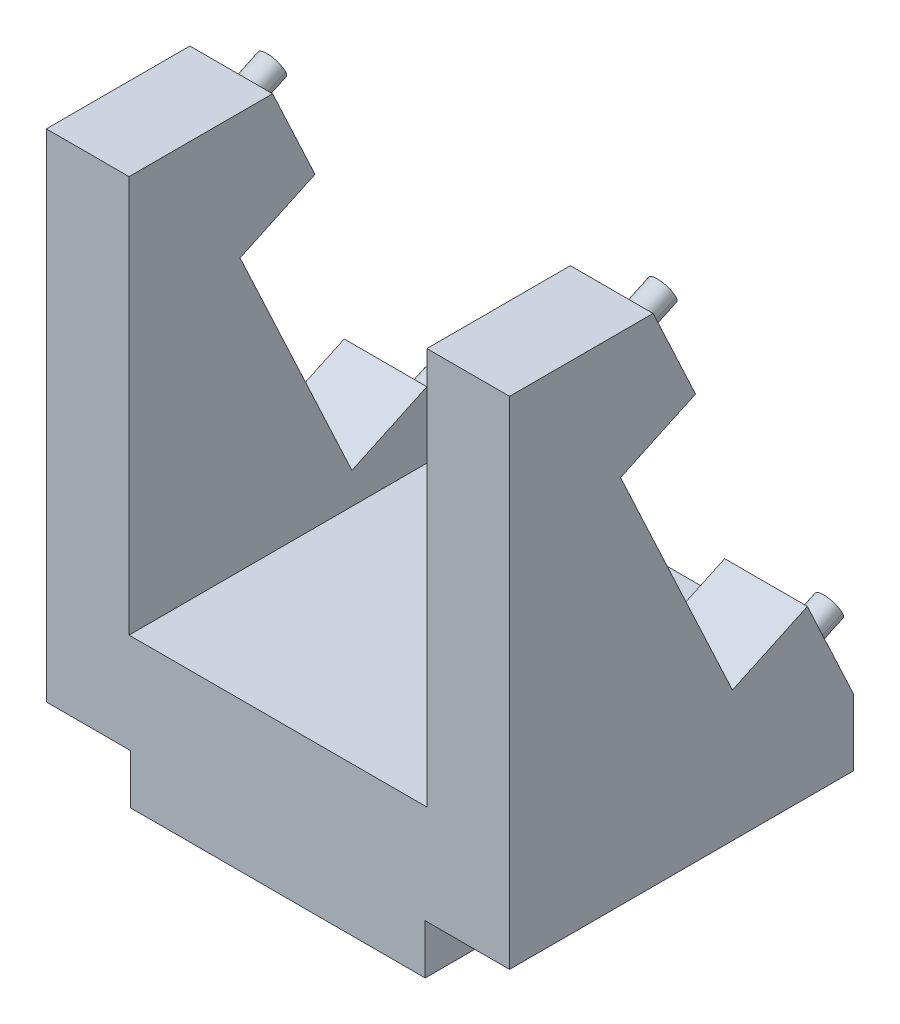
ISO-10303-21;
HEADER;
FILE_DESCRIPTION(('STEP AP214'),'2;1');
FILE_NAME('part.step','',(''),(''),'','','');
FILE_SCHEMA(('AUTOMOTIVE_DESIGN { 1 0 10303 214 1 1 1 1 }'));
ENDSEC;
DATA;
#1=APPLICATION_CONTEXT('core data for automotive mechanical design processes');
#2=APPLICATION_PROTOCOL_DEFINITION('international standard','automotive_design',2000,#1);
#3=PRODUCT_CONTEXT('',#1,'mechanical');
#4=PRODUCT('Part','Part','',(#3));
#5=PRODUCT_RELATED_PRODUCT_CATEGORY('part','',(#4));
#6=PRODUCT_DEFINITION_FORMATION('','',#4);
#7=PRODUCT_DEFINITION_CONTEXT('part definition',#1,'design');
#8=PRODUCT_DEFINITION('design','',#6,#7);
#9=PRODUCT_DEFINITION_SHAPE('','',#8);
#10=(LENGTH_UNIT() NAMED_UNIT(*) SI_UNIT(.MILLI.,.METRE.));
#11=(NAMED_UNIT(*) PLANE_ANGLE_UNIT() SI_UNIT($,.RADIAN.));
#12=(NAMED_UNIT(*) SI_UNIT($,.STERADIAN.) SOLID_ANGLE_UNIT());
#13=UNCERTAINTY_MEASURE_WITH_UNIT(LENGTH_MEASURE(1.E-05),#10,'distance_accuracy_value','');
#14=(GEOMETRIC_REPRESENTATION_CONTEXT(3) GLOBAL_UNCERTAINTY_ASSIGNED_CONTEXT((#13)) GLOBAL_UNIT_ASSIGNED_CONTEXT((#10,
#11,#12)) REPRESENTATION_CONTEXT('',''));
#15=CARTESIAN_POINT('',(0.,0.,0.));
#16=DIRECTION('',(0.,0.,1.));
#17=DIRECTION('',(1.,0.,0.));
#18=AXIS2_PLACEMENT_3D('',#15,#16,#17);
#19=CARTESIAN_POINT('',(-9.,6.,20.8));
#20=DIRECTION('',(0.,-1.,0.));
#21=DIRECTION('',(0.,0.,-1.));
#22=AXIS2_PLACEMENT_3D('',#19,#20,#21);
#23=PLANE('',#22);
#24=DIRECTION('',(0.,0.,-1.));
#25=VECTOR('',#24,1.);
#26=CARTESIAN_POINT('',(9.,6.,20.8));
#27=LINE('',#26,#25);
#28=CARTESIAN_POINT('',(9.,6.,20.8));
#29=VERTEX_POINT('',#28);
#30=CARTESIAN_POINT('',(9.,6.,0.93261531631));
#31=VERTEX_POINT('',#30);
#32=EDGE_CURVE('E292',#29,#31,#27,.T.);
#33=ORIENTED_EDGE('',*,*,#32,.T.);
#34=DIRECTION('',(1.,0.,0.));
#35=VECTOR('',#34,1.);
#36=CARTESIAN_POINT('',(-9.,6.,0.93261531631));
#37=LINE('',#36,#35);
#38=CARTESIAN_POINT('',(-9.,6.,0.93261531631));
#39=VERTEX_POINT('',#38);
#40=EDGE_CURVE('E399',#39,#31,#37,.T.);
#41=ORIENTED_EDGE('',*,*,#40,.F.);
#42=DIRECTION('',(0.,0.,-1.));
#43=VECTOR('',#42,1.);
#44=CARTESIAN_POINT('',(-9.,6.,20.8));
#45=LINE('',#44,#43);
#46=CARTESIAN_POINT('',(-9.,6.,20.8));
#47=VERTEX_POINT('',#46);
#48=EDGE_CURVE('E307',#47,#39,#45,.T.);
#49=ORIENTED_EDGE('',*,*,#48,.F.);
#50=DIRECTION('',(1.,0.,0.));
#51=VECTOR('',#50,1.);
#52=CARTESIAN_POINT('',(-9.,6.,20.8));
#53=LINE('',#52,#51);
#54=EDGE_CURVE('E335',#47,#29,#53,.T.);
#55=ORIENTED_EDGE('',*,*,#54,.T.);
#56=EDGE_LOOP('',(#33,#41,#49,#55));
#57=FACE_BOUND('',#56,.T.);
#58=ADVANCED_FACE('F16',(#57),#23,.F.);
#59=CARTESIAN_POINT('',(-8.9,0.,16.8));
#60=DIRECTION('',(0.,0.,-1.));
#61=DIRECTION('',(0.,-1.,0.));
#62=AXIS2_PLACEMENT_3D('',#59,#60,#61);
#63=PLANE('',#62);
#64=DIRECTION('',(0.,-1.,0.));
#65=VECTOR('',#64,1.);
#66=CARTESIAN_POINT('',(8.9,0.,16.8));
#67=LINE('',#66,#65);
#68=CARTESIAN_POINT('',(8.9,0.,16.8));
#69=VERTEX_POINT('',#68);
#70=CARTESIAN_POINT('',(8.9,-3.,16.8));
#71=VERTEX_POINT('',#70);
#72=EDGE_CURVE('E10',#69,#71,#67,.T.);
#73=ORIENTED_EDGE('',*,*,#72,.T.);
#74=DIRECTION('',(1.,0.,0.));
#75=VECTOR('',#74,1.);
#76=CARTESIAN_POINT('',(-8.9,-3.,16.8));
#77=LINE('',#76,#75);
#78=CARTESIAN_POINT('',(-8.9,-3.,16.8));
#79=VERTEX_POINT('',#78);
#80=EDGE_CURVE('E44',#79,#71,#77,.T.);
#81=ORIENTED_EDGE('',*,*,#80,.F.);
#82=DIRECTION('',(0.,-1.,0.));
#83=VECTOR('',#82,1.);
#84=CARTESIAN_POINT('',(-8.9,0.,16.8));
#85=LINE('',#84,#83);
#86=CARTESIAN_POINT('',(-8.9,0.,16.8));
#87=VERTEX_POINT('',#86);
#88=EDGE_CURVE('E193',#87,#79,#85,.T.);
#89=ORIENTED_EDGE('',*,*,#88,.F.);
#90=DIRECTION('',(1.,0.,0.));
#91=VECTOR('',#90,1.);
#92=CARTESIAN_POINT('',(-8.9,0.,16.8));
#93=LINE('',#92,#91);
#94=EDGE_CURVE('E190',#87,#69,#93,.T.);
#95=ORIENTED_EDGE('',*,*,#94,.T.);
#96=EDGE_LOOP('',(#73,#81,#89,#95));
#97=FACE_BOUND('',#96,.T.);
#98=ADVANCED_FACE('F191',(#97),#63,.T.);
#99=CARTESIAN_POINT('',(8.9,0.,16.8));
#100=DIRECTION('',(1.,0.,0.));
#101=DIRECTION('',(0.,1.,0.));
#102=AXIS2_PLACEMENT_3D('',#99,#100,#101);
#103=PLANE('',#102);
#104=DIRECTION('',(0.,-1.,0.));
#105=VECTOR('',#104,1.);
#106=CARTESIAN_POINT('',(8.9,0.,20.8));
#107=LINE('',#106,#105);
#108=CARTESIAN_POINT('',(8.9,0.,20.8));
#109=VERTEX_POINT('',#108);
#110=CARTESIAN_POINT('',(8.9,-3.,20.8));
#111=VERTEX_POINT('',#110);
#112=EDGE_CURVE('E207',#109,#111,#107,.T.);
#113=ORIENTED_EDGE('',*,*,#112,.T.);
#114=DIRECTION('',(0.,0.,1.));
#115=VECTOR('',#114,1.);
#116=CARTESIAN_POINT('',(8.9,-3.,16.8));
#117=LINE('',#116,#115);
#118=EDGE_CURVE('E24',#71,#111,#117,.T.);
#119=ORIENTED_EDGE('',*,*,#118,.F.);
#120=ORIENTED_EDGE('',*,*,#72,.F.);
#121=DIRECTION('',(0.,0.,-1.));
#122=VECTOR('',#121,1.);
#123=CARTESIAN_POINT('',(8.9,0.,20.8));
#124=LINE('',#123,#122);
#125=EDGE_CURVE('E187',#109,#69,#124,.T.);
#126=ORIENTED_EDGE('',*,*,#125,.F.);
#127=EDGE_LOOP('',(#113,#119,#120,#126));
#128=FACE_BOUND('',#127,.T.);
#129=ADVANCED_FACE('F185',(#128),#103,.T.);
#130=CARTESIAN_POINT('',(0.,-3.,0.));
#131=DIRECTION('',(0.,-1.,0.));
#132=DIRECTION('',(0.,0.,-1.));
#133=AXIS2_PLACEMENT_3D('',#130,#131,#132);
#134=PLANE('',#133);
#135=DIRECTION('',(0.,0.,-1.));
#136=VECTOR('',#135,1.);
#137=CARTESIAN_POINT('',(-8.9,-3.,20.8));
#138=LINE('',#137,#136);
#139=CARTESIAN_POINT('',(-8.9,-3.,20.8));
#140=VERTEX_POINT('',#139);
#141=EDGE_CURVE('E213',#140,#79,#138,.T.);
#142=ORIENTED_EDGE('',*,*,#141,.T.);
#143=ORIENTED_EDGE('',*,*,#80,.T.);
#144=ORIENTED_EDGE('',*,*,#118,.T.);
#145=DIRECTION('',(-1.,0.,0.));
#146=VECTOR('',#145,1.);
#147=CARTESIAN_POINT('',(8.9,-3.,20.8));
#148=LINE('',#147,#146);
#149=EDGE_CURVE('E345',#111,#140,#148,.T.);
#150=ORIENTED_EDGE('',*,*,#149,.T.);
#151=EDGE_LOOP('',(#142,#143,#144,#150));
#152=FACE_BOUND('',#151,.T.);
#153=ADVANCED_FACE('F692',(#152),#134,.T.);
#154=CARTESIAN_POINT('',(-8.9,0.,20.8));
#155=DIRECTION('',(-1.,0.,0.));
#156=DIRECTION('',(0.,0.,1.));
#157=AXIS2_PLACEMENT_3D('',#154,#155,#156);
#158=PLANE('',#157);
#159=ORIENTED_EDGE('',*,*,#88,.T.);
#160=ORIENTED_EDGE('',*,*,#141,.F.);
#161=DIRECTION('',(0.,-1.,0.));
#162=VECTOR('',#161,1.);
#163=CARTESIAN_POINT('',(-8.9,0.,20.8));
#164=LINE('',#163,#162);
#165=CARTESIAN_POINT('',(-8.9,0.,20.8));
#166=VERTEX_POINT('',#165);
#167=EDGE_CURVE('E342',#166,#140,#164,.T.);
#168=ORIENTED_EDGE('',*,*,#167,.F.);
#169=DIRECTION('',(0.,0.,-1.));
#170=VECTOR('',#169,1.);
#171=CARTESIAN_POINT('',(-8.9,0.,20.8));
#172=LINE('',#171,#170);
#173=EDGE_CURVE('E197',#166,#87,#172,.T.);
#174=ORIENTED_EDGE('',*,*,#173,.T.);
#175=EDGE_LOOP('',(#159,#160,#168,#174));
#176=FACE_BOUND('',#175,.T.);
#177=ADVANCED_FACE('F697',(#176),#158,.T.);
#178=CARTESIAN_POINT('',(-14.,0.,0.));
#179=DIRECTION('',(0.,-1.,0.));
#180=DIRECTION('',(0.,0.,-1.));
#181=AXIS2_PLACEMENT_3D('',#178,#179,#180);
#182=PLANE('',#181);
#183=DIRECTION('',(1.,0.,0.));
#184=VECTOR('',#183,1.);
#185=CARTESIAN_POINT('',(-14.,0.,20.8));
#186=LINE('',#185,#184);
#187=CARTESIAN_POINT('',(-14.,0.,20.8));
#188=VERTEX_POINT('',#187);
#189=EDGE_CURVE('E338',#188,#166,#186,.T.);
#190=ORIENTED_EDGE('',*,*,#189,.F.);
#191=DIRECTION('',(0.,0.,1.));
#192=VECTOR('',#191,1.);
#193=CARTESIAN_POINT('',(-14.,0.,0.));
#194=LINE('',#193,#192);
#195=CARTESIAN_POINT('',(-14.,0.,0.));
#196=VERTEX_POINT('',#195);
#197=EDGE_CURVE('E297',#196,#188,#194,.T.);
#198=ORIENTED_EDGE('',*,*,#197,.F.);
#199=DIRECTION('',(1.,0.,0.));
#200=VECTOR('',#199,1.);
#201=CARTESIAN_POINT('',(-14.,0.,0.));
#202=LINE('',#201,#200);
#203=CARTESIAN_POINT('',(14.,0.,0.));
#204=VERTEX_POINT('',#203);
#205=EDGE_CURVE('E603',#196,#204,#202,.T.);
#206=ORIENTED_EDGE('',*,*,#205,.T.);
#207=DIRECTION('',(0.,0.,1.));
#208=VECTOR('',#207,1.);
#209=CARTESIAN_POINT('',(14.,0.,0.));
#210=LINE('',#209,#208);
#211=CARTESIAN_POINT('',(14.,0.,20.8));
#212=VERTEX_POINT('',#211);
#213=EDGE_CURVE('E253',#204,#212,#210,.T.);
#214=ORIENTED_EDGE('',*,*,#213,.T.);
#215=DIRECTION('',(1.,0.,0.));
#216=VECTOR('',#215,1.);
#217=CARTESIAN_POINT('',(8.9,0.,20.8));
#218=LINE('',#217,#216);
#219=EDGE_CURVE('E201',#109,#212,#218,.T.);
#220=ORIENTED_EDGE('',*,*,#219,.F.);
#221=ORIENTED_EDGE('',*,*,#125,.T.);
#222=ORIENTED_EDGE('',*,*,#94,.F.);
#223=ORIENTED_EDGE('',*,*,#173,.F.);
#224=EDGE_LOOP('',(#190,#198,#206,#214,#220,#221,#222,#223));
#225=FACE_BOUND('',#224,.T.);
#226=ADVANCED_FACE('F199',(#225),#182,.T.);
#227=CARTESIAN_POINT('',(0.,0.,20.8));
#228=DIRECTION('',(0.,0.,1.));
#229=DIRECTION('',(1.,0.,0.));
#230=AXIS2_PLACEMENT_3D('',#227,#228,#229);
#231=PLANE('',#230);
#232=DIRECTION('',(0.,1.,0.));
#233=VECTOR('',#232,1.);
#234=CARTESIAN_POINT('',(14.,0.,20.8));
#235=LINE('',#234,#233);
#236=CARTESIAN_POINT('',(14.,30.,20.8));
#237=VERTEX_POINT('',#236);
#238=EDGE_CURVE('E257',#212,#237,#235,.T.);
#239=ORIENTED_EDGE('',*,*,#238,.T.);
#240=DIRECTION('',(-1.,0.,0.));
#241=VECTOR('',#240,1.);
#242=CARTESIAN_POINT('',(14.,30.,20.8));
#243=LINE('',#242,#241);
#244=CARTESIAN_POINT('',(9.,30.,20.8));
#245=VERTEX_POINT('',#244);
#246=EDGE_CURVE('E328',#237,#245,#243,.T.);
#247=ORIENTED_EDGE('',*,*,#246,.T.);
#248=DIRECTION('',(0.,-1.,0.));
#249=VECTOR('',#248,1.);
#250=CARTESIAN_POINT('',(9.,30.,20.8));
#251=LINE('',#250,#249);
#252=EDGE_CURVE('E296',#245,#29,#251,.T.);
#253=ORIENTED_EDGE('',*,*,#252,.T.);
#254=ORIENTED_EDGE('',*,*,#54,.F.);
#255=DIRECTION('',(0.,-1.,0.));
#256=VECTOR('',#255,1.);
#257=CARTESIAN_POINT('',(-9.,30.,20.8));
#258=LINE('',#257,#256);
#259=CARTESIAN_POINT('',(-9.,30.,20.8));
#260=VERTEX_POINT('',#259);
#261=EDGE_CURVE('E312',#260,#47,#258,.T.);
#262=ORIENTED_EDGE('',*,*,#261,.F.);
#263=DIRECTION('',(-1.,0.,0.));
#264=VECTOR('',#263,1.);
#265=CARTESIAN_POINT('',(-9.,30.,20.8));
#266=LINE('',#265,#264);
#267=CARTESIAN_POINT('',(-14.,30.,20.8));
#268=VERTEX_POINT('',#267);
#269=EDGE_CURVE('E320',#260,#268,#266,.T.);
#270=ORIENTED_EDGE('',*,*,#269,.T.);
#271=DIRECTION('',(0.,-1.,0.));
#272=VECTOR('',#271,1.);
#273=CARTESIAN_POINT('',(-14.,30.,20.8));
#274=LINE('',#273,#272);
#275=EDGE_CURVE('E301',#268,#188,#274,.T.);
#276=ORIENTED_EDGE('',*,*,#275,.T.);
#277=ORIENTED_EDGE('',*,*,#189,.T.);
#278=ORIENTED_EDGE('',*,*,#167,.T.);
#279=ORIENTED_EDGE('',*,*,#149,.F.);
#280=ORIENTED_EDGE('',*,*,#112,.F.);
#281=ORIENTED_EDGE('',*,*,#219,.T.);
#282=EDGE_LOOP('',(#239,#247,#253,#254,#262,#270,#276,#277,#278,#279,#280,#281));
#283=FACE_BOUND('',#282,.T.);
#284=ADVANCED_FACE('F703',(#283),#231,.T.);
#285=CARTESIAN_POINT('',(-14.,30.,0.));
#286=DIRECTION('',(-1.,0.,0.));
#287=DIRECTION('',(0.,0.,1.));
#288=AXIS2_PLACEMENT_3D('',#285,#286,#287);
#289=PLANE('',#288);
#290=DIRECTION('',(0.,-0.906307787036659,-0.422618261740681));
#291=VECTOR('',#290,1.);
#292=CARTESIAN_POINT('',(-14.,22.38783328388,14.09127707196));
#293=LINE('',#292,#291);
#294=CARTESIAN_POINT('',(-14.,22.38783328388,14.09127707196));
#295=VERTEX_POINT('',#294);
#296=CARTESIAN_POINT('',(-14.,7.886908691297,7.329384884113));
#297=VERTEX_POINT('',#296);
#298=EDGE_CURVE('E272',#295,#297,#293,.T.);
#299=ORIENTED_EDGE('',*,*,#298,.T.);
#300=DIRECTION('',(0.,0.422618261740681,-0.906307787036659));
#301=VECTOR('',#300,1.);
#302=CARTESIAN_POINT('',(-14.,7.886908691297,7.329384884113));
#303=LINE('',#302,#301);
#304=CARTESIAN_POINT('',(-14.,10.,2.79784594893));
#305=VERTEX_POINT('',#304);
#306=EDGE_CURVE('E302',#297,#305,#303,.T.);
#307=ORIENTED_EDGE('',*,*,#306,.T.);
#308=DIRECTION('',(0.,-0.906307787036659,-0.422618261740681));
#309=VECTOR('',#308,1.);
#310=CARTESIAN_POINT('',(-14.,10.,2.79784594893));
#311=LINE('',#310,#309);
#312=CARTESIAN_POINT('',(-14.,4.,0.));
#313=VERTEX_POINT('',#312);
#314=EDGE_CURVE('E422',#305,#313,#311,.T.);
#315=ORIENTED_EDGE('',*,*,#314,.T.);
#316=DIRECTION('',(0.,-1.,0.));
#317=VECTOR('',#316,1.);
#318=CARTESIAN_POINT('',(-14.,4.,0.));
#319=LINE('',#318,#317);
#320=EDGE_CURVE('E484',#313,#196,#319,.T.);
#321=ORIENTED_EDGE('',*,*,#320,.T.);
#322=ORIENTED_EDGE('',*,*,#197,.T.);
#323=ORIENTED_EDGE('',*,*,#275,.F.);
#324=DIRECTION('',(0.,0.,1.));
#325=VECTOR('',#324,1.);
#326=CARTESIAN_POINT('',(-14.,30.,12.12399911203));
#327=LINE('',#326,#325);
#328=CARTESIAN_POINT('',(-14.,30.,12.12399911203));
#329=VERTEX_POINT('',#328);
#330=EDGE_CURVE('E316',#329,#268,#327,.T.);
#331=ORIENTED_EDGE('',*,*,#330,.F.);
#332=DIRECTION('',(0.,-0.906307787036659,-0.422618261740681));
#333=VECTOR('',#332,1.);
#334=CARTESIAN_POINT('',(-14.,30.,12.12399911203));
#335=LINE('',#334,#333);
#336=CARTESIAN_POINT('',(-14.,24.50092459259,9.559738136781));
#337=VERTEX_POINT('',#336);
#338=EDGE_CURVE('E483',#329,#337,#335,.T.);
#339=ORIENTED_EDGE('',*,*,#338,.T.);
#340=DIRECTION('',(0.,-0.422618261740681,0.906307787036659));
#341=VECTOR('',#340,1.);
#342=CARTESIAN_POINT('',(-14.,24.50092459259,9.559738136781));
#343=LINE('',#342,#341);
#344=EDGE_CURVE('E258',#337,#295,#343,.T.);
#345=ORIENTED_EDGE('',*,*,#344,.T.);
#346=EDGE_LOOP('',(#299,#307,#315,#321,#322,#323,#331,#339,#345));
#347=FACE_BOUND('',#346,.T.);
#348=ADVANCED_FACE('F706',(#347),#289,.T.);
#349=CARTESIAN_POINT('',(14.,7.886908691297,7.329384884113));
#350=DIRECTION('',(0.,-0.906307787036659,-0.422618261740681));
#351=DIRECTION('',(0.,0.422618261740681,-0.906307787036659));
#352=AXIS2_PLACEMENT_3D('',#349,#350,#351);
#353=PLANE('',#352);
#354=DIRECTION('',(-1.,0.,0.));
#355=VECTOR('',#354,1.);
#356=CARTESIAN_POINT('',(-9.,7.886908691297,7.329384884113));
#357=LINE('',#356,#355);
#358=CARTESIAN_POINT('',(-9.,7.886908691297,7.329384884113));
#359=VERTEX_POINT('',#358);
#360=EDGE_CURVE('E277',#359,#297,#357,.T.);
#361=ORIENTED_EDGE('',*,*,#360,.F.);
#362=DIRECTION('',(0.,0.422618261740681,-0.906307787036659));
#363=VECTOR('',#362,1.);
#364=CARTESIAN_POINT('',(-9.,7.886908691297,7.329384884113));
#365=LINE('',#364,#363);
#366=CARTESIAN_POINT('',(-9.,10.,2.79784594893));
#367=VERTEX_POINT('',#366);
#368=EDGE_CURVE('E311',#359,#367,#365,.T.);
#369=ORIENTED_EDGE('',*,*,#368,.T.);
#370=DIRECTION('',(-1.,0.,0.));
#371=VECTOR('',#370,1.);
#372=CARTESIAN_POINT('',(-9.,10.,2.79784594893));
#373=LINE('',#372,#371);
#374=EDGE_CURVE('E426',#367,#305,#373,.T.);
#375=ORIENTED_EDGE('',*,*,#374,.T.);
#376=ORIENTED_EDGE('',*,*,#306,.F.);
#377=EDGE_LOOP('',(#361,#369,#375,#376));
#378=FACE_BOUND('',#377,.T.);
#379=ADVANCED_FACE('F584',(#378),#353,.F.);
#380=CARTESIAN_POINT('',(14.,7.886908691297,7.329384884113));
#381=DIRECTION('',(0.,-0.906307787036659,-0.422618261740681));
#382=DIRECTION('',(0.,0.422618261740681,-0.906307787036659));
#383=AXIS2_PLACEMENT_3D('',#380,#381,#382);
#384=PLANE('',#383);
#385=DIRECTION('',(1.,0.,0.));
#386=VECTOR('',#385,1.);
#387=CARTESIAN_POINT('',(9.,10.,2.79784594893));
#388=LINE('',#387,#386);
#389=CARTESIAN_POINT('',(9.,10.,2.79784594893));
#390=VERTEX_POINT('',#389);
#391=CARTESIAN_POINT('',(14.,10.,2.79784594893));
#392=VERTEX_POINT('',#391);
#393=EDGE_CURVE('E414',#390,#392,#388,.T.);
#394=ORIENTED_EDGE('',*,*,#393,.F.);
#395=DIRECTION('',(0.,0.422618261740681,-0.906307787036659));
#396=VECTOR('',#395,1.);
#397=CARTESIAN_POINT('',(9.,7.886908691297,7.329384884113));
#398=LINE('',#397,#396);
#399=CARTESIAN_POINT('',(9.,7.886908691297,7.329384884113));
#400=VERTEX_POINT('',#399);
#401=EDGE_CURVE('E276',#400,#390,#398,.T.);
#402=ORIENTED_EDGE('',*,*,#401,.F.);
#403=DIRECTION('',(-1.,0.,0.));
#404=VECTOR('',#403,1.);
#405=CARTESIAN_POINT('',(14.,7.886908691297,7.329384884113));
#406=LINE('',#405,#404);
#407=CARTESIAN_POINT('',(14.,7.886908691297,7.329384884113));
#408=VERTEX_POINT('',#407);
#409=EDGE_CURVE('E281',#408,#400,#406,.T.);
#410=ORIENTED_EDGE('',*,*,#409,.F.);
#411=DIRECTION('',(0.,0.422618261740681,-0.906307787036659));
#412=VECTOR('',#411,1.);
#413=CARTESIAN_POINT('',(14.,7.886908691297,7.329384884113));
#414=LINE('',#413,#412);
#415=EDGE_CURVE('E256',#408,#392,#414,.T.);
#416=ORIENTED_EDGE('',*,*,#415,.T.);
#417=EDGE_LOOP('',(#394,#402,#410,#416));
#418=FACE_BOUND('',#417,.T.);
#419=ADVANCED_FACE('F712',(#418),#384,.F.);
#420=CARTESIAN_POINT('',(-9.,30.,20.8));
#421=DIRECTION('',(-1.,0.,0.));
#422=DIRECTION('',(0.,0.,1.));
#423=AXIS2_PLACEMENT_3D('',#420,#421,#422);
#424=PLANE('',#423);
#425=DIRECTION('',(0.,-0.906307787036659,-0.422618261740681));
#426=VECTOR('',#425,1.);
#427=CARTESIAN_POINT('',(-9.,30.,12.12399911203));
#428=LINE('',#427,#426);
#429=CARTESIAN_POINT('',(-9.,30.,12.12399911203));
#430=VERTEX_POINT('',#429);
#431=CARTESIAN_POINT('',(-9.,24.50092459259,9.559738136781));
#432=VERTEX_POINT('',#431);
#433=EDGE_CURVE('E493',#430,#432,#428,.T.);
#434=ORIENTED_EDGE('',*,*,#433,.F.);
#435=DIRECTION('',(0.,0.,1.));
#436=VECTOR('',#435,1.);
#437=CARTESIAN_POINT('',(-9.,30.,12.12399911203));
#438=LINE('',#437,#436);
#439=EDGE_CURVE('E324',#430,#260,#438,.T.);
#440=ORIENTED_EDGE('',*,*,#439,.T.);
#441=ORIENTED_EDGE('',*,*,#261,.T.);
#442=ORIENTED_EDGE('',*,*,#48,.T.);
#443=DIRECTION('',(0.,-0.906307787036659,-0.422618261740681));
#444=VECTOR('',#443,1.);
#445=CARTESIAN_POINT('',(-9.,10.,2.79784594893));
#446=LINE('',#445,#444);
#447=EDGE_CURVE('E395',#367,#39,#446,.T.);
#448=ORIENTED_EDGE('',*,*,#447,.F.);
#449=ORIENTED_EDGE('',*,*,#368,.F.);
#450=DIRECTION('',(0.,0.906307787036659,0.422618261740681));
#451=VECTOR('',#450,1.);
#452=CARTESIAN_POINT('',(-9.,7.886908691297,7.329384884113));
#453=LINE('',#452,#451);
#454=CARTESIAN_POINT('',(-9.,22.38783328388,14.09127707196));
#455=VERTEX_POINT('',#454);
#456=EDGE_CURVE('E288',#359,#455,#453,.T.);
#457=ORIENTED_EDGE('',*,*,#456,.T.);
#458=DIRECTION('',(0.,-0.422618261740681,0.906307787036659));
#459=VECTOR('',#458,1.);
#460=CARTESIAN_POINT('',(-9.,24.50092459259,9.559738136781));
#461=LINE('',#460,#459);
#462=EDGE_CURVE('E447',#432,#455,#461,.T.);
#463=ORIENTED_EDGE('',*,*,#462,.F.);
#464=EDGE_LOOP('',(#434,#440,#441,#442,#448,#449,#457,#463));
#465=FACE_BOUND('',#464,.T.);
#466=ADVANCED_FACE('F577',(#465),#424,.F.);
#467=CARTESIAN_POINT('',(14.,30.,0.));
#468=DIRECTION('',(0.,1.,0.));
#469=DIRECTION('',(1.,0.,0.));
#470=AXIS2_PLACEMENT_3D('',#467,#468,#469);
#471=PLANE('',#470);
#472=ORIENTED_EDGE('',*,*,#246,.F.);
#473=DIRECTION('',(0.,0.,1.));
#474=VECTOR('',#473,1.);
#475=CARTESIAN_POINT('',(14.,30.,12.12399911203));
#476=LINE('',#475,#474);
#477=CARTESIAN_POINT('',(14.,30.,12.12399911203));
#478=VERTEX_POINT('',#477);
#479=EDGE_CURVE('E262',#478,#237,#476,.T.);
#480=ORIENTED_EDGE('',*,*,#479,.F.);
#481=DIRECTION('',(-1.,0.,0.));
#482=VECTOR('',#481,1.);
#483=CARTESIAN_POINT('',(14.,30.,12.12399911203));
#484=LINE('',#483,#482);
#485=CARTESIAN_POINT('',(9.,30.,12.12399911203));
#486=VERTEX_POINT('',#485);
#487=EDGE_CURVE('E376',#478,#486,#484,.T.);
#488=ORIENTED_EDGE('',*,*,#487,.T.);
#489=DIRECTION('',(0.,0.,1.));
#490=VECTOR('',#489,1.);
#491=CARTESIAN_POINT('',(9.,30.,12.12399911203));
#492=LINE('',#491,#490);
#493=EDGE_CURVE('E306',#486,#245,#492,.T.);
#494=ORIENTED_EDGE('',*,*,#493,.T.);
#495=EDGE_LOOP('',(#472,#480,#488,#494));
#496=FACE_BOUND('',#495,.T.);
#497=ADVANCED_FACE('F534',(#496),#471,.T.);
#498=CARTESIAN_POINT('',(14.,30.,0.));
#499=DIRECTION('',(0.,1.,0.));
#500=DIRECTION('',(1.,0.,0.));
#501=AXIS2_PLACEMENT_3D('',#498,#499,#500);
#502=PLANE('',#501);
#503=DIRECTION('',(-1.,0.,0.));
#504=VECTOR('',#503,1.);
#505=CARTESIAN_POINT('',(-9.,30.,12.12399911203));
#506=LINE('',#505,#504);
#507=EDGE_CURVE('E478',#430,#329,#506,.T.);
#508=ORIENTED_EDGE('',*,*,#507,.T.);
#509=ORIENTED_EDGE('',*,*,#330,.T.);
#510=ORIENTED_EDGE('',*,*,#269,.F.);
#511=ORIENTED_EDGE('',*,*,#439,.F.);
#512=EDGE_LOOP('',(#508,#509,#510,#511));
#513=FACE_BOUND('',#512,.T.);
#514=ADVANCED_FACE('F717',(#513),#502,.T.);
#515=CARTESIAN_POINT('',(9.,6.,20.8));
#516=DIRECTION('',(1.,0.,0.));
#517=DIRECTION('',(0.,1.,0.));
#518=AXIS2_PLACEMENT_3D('',#515,#516,#517);
#519=PLANE('',#518);
#520=DIRECTION('',(0.,0.906307787036659,0.422618261740681));
#521=VECTOR('',#520,1.);
#522=CARTESIAN_POINT('',(9.,7.886908691297,7.329384884113));
#523=LINE('',#522,#521);
#524=CARTESIAN_POINT('',(9.,22.38783328388,14.09127707196));
#525=VERTEX_POINT('',#524);
#526=EDGE_CURVE('E285',#400,#525,#523,.T.);
#527=ORIENTED_EDGE('',*,*,#526,.F.);
#528=ORIENTED_EDGE('',*,*,#401,.T.);
#529=DIRECTION('',(0.,-0.906307787036659,-0.422618261740681));
#530=VECTOR('',#529,1.);
#531=CARTESIAN_POINT('',(9.,10.,2.79784594893));
#532=LINE('',#531,#530);
#533=EDGE_CURVE('E405',#390,#31,#532,.T.);
#534=ORIENTED_EDGE('',*,*,#533,.T.);
#535=ORIENTED_EDGE('',*,*,#32,.F.);
#536=ORIENTED_EDGE('',*,*,#252,.F.);
#537=ORIENTED_EDGE('',*,*,#493,.F.);
#538=DIRECTION('',(0.,-0.906307787036659,-0.422618261740681));
#539=VECTOR('',#538,1.);
#540=CARTESIAN_POINT('',(9.,30.,12.12399911203));
#541=LINE('',#540,#539);
#542=CARTESIAN_POINT('',(9.,24.50092459259,9.559738136781));
#543=VERTEX_POINT('',#542);
#544=EDGE_CURVE('E497',#486,#543,#541,.T.);
#545=ORIENTED_EDGE('',*,*,#544,.T.);
#546=DIRECTION('',(0.,-0.422618261740681,0.906307787036659));
#547=VECTOR('',#546,1.);
#548=CARTESIAN_POINT('',(9.,24.50092459259,9.559738136781));
#549=LINE('',#548,#547);
#550=EDGE_CURVE('E248',#543,#525,#549,.T.);
#551=ORIENTED_EDGE('',*,*,#550,.T.);
#552=EDGE_LOOP('',(#527,#528,#534,#535,#536,#537,#545,#551));
#553=FACE_BOUND('',#552,.T.);
#554=ADVANCED_FACE('F569',(#553),#519,.F.);
#555=CARTESIAN_POINT('',(14.,22.38783328388,14.09127707196));
#556=DIRECTION('',(0.,-0.422618261740681,0.906307787036659));
#557=DIRECTION('',(-1.,0.,0.));
#558=AXIS2_PLACEMENT_3D('',#555,#556,#557);
#559=PLANE('',#558);
#560=DIRECTION('',(-1.,0.,0.));
#561=VECTOR('',#560,1.);
#562=CARTESIAN_POINT('',(-9.,22.38783328388,14.09127707196));
#563=LINE('',#562,#561);
#564=EDGE_CURVE('E263',#455,#295,#563,.T.);
#565=ORIENTED_EDGE('',*,*,#564,.F.);
#566=ORIENTED_EDGE('',*,*,#456,.F.);
#567=ORIENTED_EDGE('',*,*,#360,.T.);
#568=ORIENTED_EDGE('',*,*,#298,.F.);
#569=EDGE_LOOP('',(#565,#566,#567,#568));
#570=FACE_BOUND('',#569,.T.);
#571=ADVANCED_FACE('F586',(#570),#559,.F.);
#572=CARTESIAN_POINT('',(14.,22.38783328388,14.09127707196));
#573=DIRECTION('',(0.,-0.422618261740681,0.906307787036659));
#574=DIRECTION('',(-1.,0.,0.));
#575=AXIS2_PLACEMENT_3D('',#572,#573,#574);
#576=PLANE('',#575);
#577=ORIENTED_EDGE('',*,*,#409,.T.);
#578=ORIENTED_EDGE('',*,*,#526,.T.);
#579=DIRECTION('',(-1.,0.,0.));
#580=VECTOR('',#579,1.);
#581=CARTESIAN_POINT('',(14.,22.38783328388,14.09127707196));
#582=LINE('',#581,#580);
#583=CARTESIAN_POINT('',(14.,22.38783328388,14.09127707196));
#584=VERTEX_POINT('',#583);
#585=EDGE_CURVE('E244',#584,#525,#582,.T.);
#586=ORIENTED_EDGE('',*,*,#585,.F.);
#587=DIRECTION('',(0.,-0.906307787036659,-0.422618261740681));
#588=VECTOR('',#587,1.);
#589=CARTESIAN_POINT('',(14.,22.38783328388,14.09127707196));
#590=LINE('',#589,#588);
#591=EDGE_CURVE('E271',#584,#408,#590,.T.);
#592=ORIENTED_EDGE('',*,*,#591,.T.);
#593=EDGE_LOOP('',(#577,#578,#586,#592));
#594=FACE_BOUND('',#593,.T.);
#595=ADVANCED_FACE('F722',(#594),#576,.F.);
#596=CARTESIAN_POINT('',(14.,0.,0.));
#597=DIRECTION('',(1.,0.,0.));
#598=DIRECTION('',(0.,1.,0.));
#599=AXIS2_PLACEMENT_3D('',#596,#597,#598);
#600=PLANE('',#599);
#601=DIRECTION('',(0.,-0.906307787036659,-0.422618261740681));
#602=VECTOR('',#601,1.);
#603=CARTESIAN_POINT('',(14.,30.,12.12399911203));
#604=LINE('',#603,#602);
#605=CARTESIAN_POINT('',(14.,24.50092459259,9.559738136781));
#606=VERTEX_POINT('',#605);
#607=EDGE_CURVE('E382',#478,#606,#604,.T.);
#608=ORIENTED_EDGE('',*,*,#607,.F.);
#609=ORIENTED_EDGE('',*,*,#479,.T.);
#610=ORIENTED_EDGE('',*,*,#238,.F.);
#611=ORIENTED_EDGE('',*,*,#213,.F.);
#612=DIRECTION('',(0.,1.,0.));
#613=VECTOR('',#612,1.);
#614=CARTESIAN_POINT('',(14.,0.,0.));
#615=LINE('',#614,#613);
#616=CARTESIAN_POINT('',(14.,4.,0.));
#617=VERTEX_POINT('',#616);
#618=EDGE_CURVE('E604',#204,#617,#615,.T.);
#619=ORIENTED_EDGE('',*,*,#618,.T.);
#620=DIRECTION('',(0.,-0.906307787036659,-0.422618261740681));
#621=VECTOR('',#620,1.);
#622=CARTESIAN_POINT('',(14.,10.,2.79784594893));
#623=LINE('',#622,#621);
#624=EDGE_CURVE('E418',#392,#617,#623,.T.);
#625=ORIENTED_EDGE('',*,*,#624,.F.);
#626=ORIENTED_EDGE('',*,*,#415,.F.);
#627=ORIENTED_EDGE('',*,*,#591,.F.);
#628=DIRECTION('',(0.,-0.422618261740681,0.906307787036659));
#629=VECTOR('',#628,1.);
#630=CARTESIAN_POINT('',(14.,24.50092459259,9.559738136781));
#631=LINE('',#630,#629);
#632=EDGE_CURVE('E252',#606,#584,#631,.T.);
#633=ORIENTED_EDGE('',*,*,#632,.F.);
#634=EDGE_LOOP('',(#608,#609,#610,#611,#619,#625,#626,#627,#633));
#635=FACE_BOUND('',#634,.T.);
#636=ADVANCED_FACE('F528',(#635),#600,.T.);
#637=CARTESIAN_POINT('',(14.,24.50092459259,9.559738136781));
#638=DIRECTION('',(0.,0.906307787036659,0.422618261740681));
#639=DIRECTION('',(1.,0.,0.));
#640=AXIS2_PLACEMENT_3D('',#637,#638,#639);
#641=PLANE('',#640);
#642=DIRECTION('',(1.,0.,0.));
#643=VECTOR('',#642,1.);
#644=CARTESIAN_POINT('',(-14.,24.50092459259,9.559738136781));
#645=LINE('',#644,#643);
#646=EDGE_CURVE('E488',#337,#432,#645,.T.);
#647=ORIENTED_EDGE('',*,*,#646,.T.);
#648=ORIENTED_EDGE('',*,*,#462,.T.);
#649=ORIENTED_EDGE('',*,*,#564,.T.);
#650=ORIENTED_EDGE('',*,*,#344,.F.);
#651=EDGE_LOOP('',(#647,#648,#649,#650));
#652=FACE_BOUND('',#651,.T.);
#653=ADVANCED_FACE('F592',(#652),#641,.F.);
#654=CARTESIAN_POINT('',(14.,24.50092459259,9.559738136781));
#655=DIRECTION('',(0.,0.906307787036659,0.422618261740681));
#656=DIRECTION('',(1.,0.,0.));
#657=AXIS2_PLACEMENT_3D('',#654,#655,#656);
#658=PLANE('',#657);
#659=ORIENTED_EDGE('',*,*,#585,.T.);
#660=ORIENTED_EDGE('',*,*,#550,.F.);
#661=DIRECTION('',(1.,0.,0.));
#662=VECTOR('',#661,1.);
#663=CARTESIAN_POINT('',(9.,24.50092459259,9.559738136781));
#664=LINE('',#663,#662);
#665=EDGE_CURVE('E386',#543,#606,#664,.T.);
#666=ORIENTED_EDGE('',*,*,#665,.T.);
#667=ORIENTED_EDGE('',*,*,#632,.T.);
#668=EDGE_LOOP('',(#659,#660,#666,#667));
#669=FACE_BOUND('',#668,.T.);
#670=ADVANCED_FACE('F733',(#669),#658,.F.);
#671=CARTESIAN_POINT('',(14.,1.559661304108,-3.344704460311));
#672=DIRECTION('',(0.,0.422618261740681,-0.906307787036659));
#673=DIRECTION('',(-1.,0.,0.));
#674=AXIS2_PLACEMENT_3D('',#671,#672,#673);
#675=PLANE('',#674);
#676=CARTESIAN_POINT('',(-11.8,7.190603281825,-0.7189530934756));
#677=DIRECTION('',(0.,0.422618261740681,-0.906307787036659));
#678=DIRECTION('',(1.,0.,0.));
#679=AXIS2_PLACEMENT_3D('',#676,#677,#678);
#680=CIRCLE('',#679,0.8);
#681=CARTESIAN_POINT('',(-11.,7.190603281825,-0.7189530934756));
#682=VERTEX_POINT('',#681);
#683=CARTESIAN_POINT('',(-12.6,7.190603281825,-0.7189530934756));
#684=VERTEX_POINT('',#683);
#685=EDGE_CURVE('E243',#682,#684,#680,.T.);
#686=ORIENTED_EDGE('',*,*,#685,.T.);
#687=CARTESIAN_POINT('',(-11.8,7.190603281825,-0.7189530934756));
#688=DIRECTION('',(0.,0.422618261740681,-0.906307787036659));
#689=DIRECTION('',(-1.,0.,0.));
#690=AXIS2_PLACEMENT_3D('',#687,#688,#689);
#691=CIRCLE('',#690,0.8);
#692=EDGE_CURVE('E238',#684,#682,#691,.T.);
#693=ORIENTED_EDGE('',*,*,#692,.T.);
#694=EDGE_LOOP('',(#686,#693));
#695=FACE_BOUND('',#694,.T.);
#696=ADVANCED_FACE('F736',(#695),#675,.T.);
#697=CARTESIAN_POINT('',(-11.8,6.345366758343,1.093662480598));
#698=DIRECTION('',(0.,0.422618261740681,-0.906307787036659));
#699=DIRECTION('',(-1.,0.,0.));
#700=AXIS2_PLACEMENT_3D('',#697,#698,#699);
#701=CYLINDRICAL_SURFACE('',#700,0.8);
#702=DIRECTION('',(0.,0.422618261740681,-0.906307787036659));
#703=VECTOR('',#702,1.);
#704=CARTESIAN_POINT('',(-12.6,6.345366758343,1.093662480598));
#705=LINE('',#704,#703);
#706=CARTESIAN_POINT('',(-12.6,6.345366758343,1.093662480598));
#707=VERTEX_POINT('',#706);
#708=EDGE_CURVE('E239',#707,#684,#705,.T.);
#709=ORIENTED_EDGE('',*,*,#708,.T.);
#710=ORIENTED_EDGE('',*,*,#685,.F.);
#711=DIRECTION('',(0.,0.422618261740681,-0.906307787036659));
#712=VECTOR('',#711,1.);
#713=CARTESIAN_POINT('',(-11.,6.345366758343,1.093662480598));
#714=LINE('',#713,#712);
#715=CARTESIAN_POINT('',(-11.,6.345366758343,1.093662480598));
#716=VERTEX_POINT('',#715);
#717=EDGE_CURVE('E234',#716,#682,#714,.T.);
#718=ORIENTED_EDGE('',*,*,#717,.F.);
#719=CARTESIAN_POINT('',(-11.8,6.345366758343,1.093662480598));
#720=DIRECTION('',(0.,0.422618261740681,-0.906307787036659));
#721=DIRECTION('',(1.,0.,0.));
#722=AXIS2_PLACEMENT_3D('',#719,#720,#721);
#723=CIRCLE('',#722,0.8);
#724=EDGE_CURVE('E436',#716,#707,#723,.T.);
#725=ORIENTED_EDGE('',*,*,#724,.T.);
#726=EDGE_LOOP('',(#709,#710,#718,#725));
#727=FACE_BOUND('',#726,.T.);
#728=ADVANCED_FACE('F742',(#727),#701,.T.);
#729=CARTESIAN_POINT('',(-11.8,6.345366758343,1.093662480598));
#730=DIRECTION('',(0.,0.422618261740681,-0.906307787036659));
#731=DIRECTION('',(-1.,0.,0.));
#732=AXIS2_PLACEMENT_3D('',#729,#730,#731);
#733=CYLINDRICAL_SURFACE('',#732,0.8);
#734=ORIENTED_EDGE('',*,*,#717,.T.);
#735=ORIENTED_EDGE('',*,*,#692,.F.);
#736=ORIENTED_EDGE('',*,*,#708,.F.);
#737=CARTESIAN_POINT('',(-11.8,6.345366758343,1.093662480598));
#738=DIRECTION('',(0.,0.422618261740681,-0.906307787036659));
#739=DIRECTION('',(-1.,0.,0.));
#740=AXIS2_PLACEMENT_3D('',#737,#738,#739);
#741=CIRCLE('',#740,0.8);
#742=EDGE_CURVE('E440',#707,#716,#741,.T.);
#743=ORIENTED_EDGE('',*,*,#742,.T.);
#744=EDGE_LOOP('',(#734,#735,#736,#743));
#745=FACE_BOUND('',#744,.T.);
#746=ADVANCED_FACE('F738',(#745),#733,.T.);
#747=CARTESIAN_POINT('',(14.,1.559661304108,-3.344704460311));
#748=DIRECTION('',(0.,0.422618261740681,-0.906307787036659));
#749=DIRECTION('',(-1.,0.,0.));
#750=AXIS2_PLACEMENT_3D('',#747,#748,#749);
#751=PLANE('',#750);
#752=CARTESIAN_POINT('',(11.8,7.190603281825,-0.7189530934756));
#753=DIRECTION('',(0.,0.422618261740681,-0.906307787036659));
#754=DIRECTION('',(1.,0.,0.));
#755=AXIS2_PLACEMENT_3D('',#752,#753,#754);
#756=CIRCLE('',#755,0.8);
#757=CARTESIAN_POINT('',(12.6,7.190603281825,-0.7189530934756));
#758=VERTEX_POINT('',#757);
#759=CARTESIAN_POINT('',(11.,7.190603281825,-0.7189530934756));
#760=VERTEX_POINT('',#759);
#761=EDGE_CURVE('E231',#758,#760,#756,.T.);
#762=ORIENTED_EDGE('',*,*,#761,.T.);
#763=CARTESIAN_POINT('',(11.8,7.190603281825,-0.7189530934756));
#764=DIRECTION('',(0.,0.422618261740681,-0.906307787036659));
#765=DIRECTION('',(-1.,0.,0.));
#766=AXIS2_PLACEMENT_3D('',#763,#764,#765);
#767=CIRCLE('',#766,0.8);
#768=EDGE_CURVE('E226',#760,#758,#767,.T.);
#769=ORIENTED_EDGE('',*,*,#768,.T.);
#770=EDGE_LOOP('',(#762,#769));
#771=FACE_BOUND('',#770,.T.);
#772=ADVANCED_FACE('F741',(#771),#751,.T.);
#773=CARTESIAN_POINT('',(11.8,6.345366758343,1.093662480598));
#774=DIRECTION('',(0.,0.422618261740681,-0.906307787036659));
#775=DIRECTION('',(-1.,0.,0.));
#776=AXIS2_PLACEMENT_3D('',#773,#774,#775);
#777=CYLINDRICAL_SURFACE('',#776,0.8);
#778=DIRECTION('',(0.,0.422618261740681,-0.906307787036659));
#779=VECTOR('',#778,1.);
#780=CARTESIAN_POINT('',(11.,6.345366758343,1.093662480598));
#781=LINE('',#780,#779);
#782=CARTESIAN_POINT('',(11.,6.345366758343,1.093662480598));
#783=VERTEX_POINT('',#782);
#784=EDGE_CURVE('E228',#783,#760,#781,.T.);
#785=ORIENTED_EDGE('',*,*,#784,.T.);
#786=ORIENTED_EDGE('',*,*,#761,.F.);
#787=DIRECTION('',(0.,0.422618261740681,-0.906307787036659));
#788=VECTOR('',#787,1.);
#789=CARTESIAN_POINT('',(12.6,6.345366758343,1.093662480598));
#790=LINE('',#789,#788);
#791=CARTESIAN_POINT('',(12.6,6.345366758343,1.093662480598));
#792=VERTEX_POINT('',#791);
#793=EDGE_CURVE('E357',#792,#758,#790,.T.);
#794=ORIENTED_EDGE('',*,*,#793,.F.);
#795=CARTESIAN_POINT('',(11.8,6.345366758343,1.093662480598));
#796=DIRECTION('',(0.,0.422618261740681,-0.906307787036659));
#797=DIRECTION('',(1.,0.,0.));
#798=AXIS2_PLACEMENT_3D('',#795,#796,#797);
#799=CIRCLE('',#798,0.8);
#800=EDGE_CURVE('E432',#792,#783,#799,.T.);
#801=ORIENTED_EDGE('',*,*,#800,.T.);
#802=EDGE_LOOP('',(#785,#786,#794,#801));
#803=FACE_BOUND('',#802,.T.);
#804=ADVANCED_FACE('F746',(#803),#777,.T.);
#805=CARTESIAN_POINT('',(11.8,6.345366758343,1.093662480598));
#806=DIRECTION('',(0.,0.422618261740681,-0.906307787036659));
#807=DIRECTION('',(-1.,0.,0.));
#808=AXIS2_PLACEMENT_3D('',#805,#806,#807);
#809=CYLINDRICAL_SURFACE('',#808,0.8);
#810=ORIENTED_EDGE('',*,*,#793,.T.);
#811=ORIENTED_EDGE('',*,*,#768,.F.);
#812=ORIENTED_EDGE('',*,*,#784,.F.);
#813=CARTESIAN_POINT('',(11.8,6.345366758343,1.093662480598));
#814=DIRECTION('',(0.,0.422618261740681,-0.906307787036659));
#815=DIRECTION('',(-1.,0.,0.));
#816=AXIS2_PLACEMENT_3D('',#813,#814,#815);
#817=CIRCLE('',#816,0.8);
#818=EDGE_CURVE('E433',#783,#792,#817,.T.);
#819=ORIENTED_EDGE('',*,*,#818,.T.);
#820=EDGE_LOOP('',(#810,#811,#812,#819));
#821=FACE_BOUND('',#820,.T.);
#822=ADVANCED_FACE('F750',(#821),#809,.T.);
#823=CARTESIAN_POINT('',(14.,1.559661304108,-3.344704460311));
#824=DIRECTION('',(0.,0.422618261740681,-0.906307787036659));
#825=DIRECTION('',(-1.,0.,0.));
#826=AXIS2_PLACEMENT_3D('',#823,#824,#825);
#827=PLANE('',#826);
#828=CARTESIAN_POINT('',(-11.8,28.7607286133,9.339361535953));
#829=DIRECTION('',(0.,0.422618261740681,-0.906307787036659));
#830=DIRECTION('',(1.,0.,0.));
#831=AXIS2_PLACEMENT_3D('',#828,#829,#830);
#832=CIRCLE('',#831,0.8);
#833=CARTESIAN_POINT('',(-11.,28.7607286133,9.339361535953));
#834=VERTEX_POINT('',#833);
#835=CARTESIAN_POINT('',(-12.6,28.7607286133,9.339361535953));
#836=VERTEX_POINT('',#835);
#837=EDGE_CURVE('E359',#834,#836,#832,.T.);
#838=ORIENTED_EDGE('',*,*,#837,.T.);
#839=CARTESIAN_POINT('',(-11.8,28.7607286133,9.339361535953));
#840=DIRECTION('',(0.,0.422618261740681,-0.906307787036659));
#841=DIRECTION('',(-1.,0.,0.));
#842=AXIS2_PLACEMENT_3D('',#839,#840,#841);
#843=CIRCLE('',#842,0.8);
#844=EDGE_CURVE('E373',#836,#834,#843,.T.);
#845=ORIENTED_EDGE('',*,*,#844,.T.);
#846=EDGE_LOOP('',(#838,#845));
#847=FACE_BOUND('',#846,.T.);
#848=ADVANCED_FACE('F760',(#847),#827,.T.);
#849=CARTESIAN_POINT('',(-11.8,27.91549208982,11.15197711003));
#850=DIRECTION('',(0.,0.422618261740681,-0.906307787036659));
#851=DIRECTION('',(-1.,0.,0.));
#852=AXIS2_PLACEMENT_3D('',#849,#850,#851);
#853=CYLINDRICAL_SURFACE('',#852,0.8);
#854=DIRECTION('',(0.,0.422618261740719,-0.906307787036641));
#855=VECTOR('',#854,1.);
#856=CARTESIAN_POINT('',(-12.6,27.91549208982,11.15197711003));
#857=LINE('',#856,#855);
#858=CARTESIAN_POINT('',(-12.6,27.91549208982,11.15197711003));
#859=VERTEX_POINT('',#858);
#860=EDGE_CURVE('E355',#859,#836,#857,.T.);
#861=ORIENTED_EDGE('',*,*,#860,.T.);
#862=ORIENTED_EDGE('',*,*,#837,.F.);
#863=DIRECTION('',(0.,0.422618261740719,-0.906307787036641));
#864=VECTOR('',#863,1.);
#865=CARTESIAN_POINT('',(-11.,27.91549208982,11.15197711003));
#866=LINE('',#865,#864);
#867=CARTESIAN_POINT('',(-11.,27.91549208982,11.15197711003));
#868=VERTEX_POINT('',#867);
#869=EDGE_CURVE('E380',#868,#834,#866,.T.);
#870=ORIENTED_EDGE('',*,*,#869,.F.);
#871=CARTESIAN_POINT('',(-11.8,27.91549208982,11.15197711003));
#872=DIRECTION('',(0.,0.422618261740681,-0.906307787036659));
#873=DIRECTION('',(1.,0.,0.));
#874=AXIS2_PLACEMENT_3D('',#871,#872,#873);
#875=CIRCLE('',#874,0.8);
#876=EDGE_CURVE('E492',#868,#859,#875,.T.);
#877=ORIENTED_EDGE('',*,*,#876,.T.);
#878=EDGE_LOOP('',(#861,#862,#870,#877));
#879=FACE_BOUND('',#878,.T.);
#880=ADVANCED_FACE('F682',(#879),#853,.T.);
#881=CARTESIAN_POINT('',(-11.8,27.91549208982,11.15197711003));
#882=DIRECTION('',(0.,0.422618261740681,-0.906307787036659));
#883=DIRECTION('',(-1.,0.,0.));
#884=AXIS2_PLACEMENT_3D('',#881,#882,#883);
#885=CYLINDRICAL_SURFACE('',#884,0.8);
#886=ORIENTED_EDGE('',*,*,#869,.T.);
#887=ORIENTED_EDGE('',*,*,#844,.F.);
#888=ORIENTED_EDGE('',*,*,#860,.F.);
#889=CARTESIAN_POINT('',(-11.8,27.91549208982,11.15197711003));
#890=DIRECTION('',(0.,0.422618261740681,-0.906307787036659));
#891=DIRECTION('',(-1.,0.,0.));
#892=AXIS2_PLACEMENT_3D('',#889,#890,#891);
#893=CIRCLE('',#892,0.8);
#894=EDGE_CURVE('E496',#859,#868,#893,.T.);
#895=ORIENTED_EDGE('',*,*,#894,.T.);
#896=EDGE_LOOP('',(#886,#887,#888,#895));
#897=FACE_BOUND('',#896,.T.);
#898=ADVANCED_FACE('F674',(#897),#885,.T.);
#899=CARTESIAN_POINT('',(14.,1.559661304108,-3.344704460311));
#900=DIRECTION('',(0.,0.422618261740681,-0.906307787036659));
#901=DIRECTION('',(-1.,0.,0.));
#902=AXIS2_PLACEMENT_3D('',#899,#900,#901);
#903=PLANE('',#902);
#904=CARTESIAN_POINT('',(11.8,28.7607286133,9.339361535953));
#905=DIRECTION('',(0.,0.422618261740681,-0.906307787036659));
#906=DIRECTION('',(1.,0.,0.));
#907=AXIS2_PLACEMENT_3D('',#904,#905,#906);
#908=CIRCLE('',#907,0.8);
#909=CARTESIAN_POINT('',(12.6,28.7607286133,9.339361535953));
#910=VERTEX_POINT('',#909);
#911=CARTESIAN_POINT('',(11.,28.7607286133,9.339361535953));
#912=VERTEX_POINT('',#911);
#913=EDGE_CURVE('E378',#910,#912,#908,.T.);
#914=ORIENTED_EDGE('',*,*,#913,.T.);
#915=CARTESIAN_POINT('',(11.8,28.7607286133,9.339361535953));
#916=DIRECTION('',(0.,0.422618261740681,-0.906307787036659));
#917=DIRECTION('',(-1.,0.,0.));
#918=AXIS2_PLACEMENT_3D('',#915,#916,#917);
#919=CIRCLE('',#918,0.8);
#920=EDGE_CURVE('E458',#912,#910,#919,.T.);
#921=ORIENTED_EDGE('',*,*,#920,.T.);
#922=EDGE_LOOP('',(#914,#921));
#923=FACE_BOUND('',#922,.T.);
#924=ADVANCED_FACE('F672',(#923),#903,.T.);
#925=CARTESIAN_POINT('',(11.8,27.91549208982,11.15197711003));
#926=DIRECTION('',(0.,0.422618261740681,-0.906307787036659));
#927=DIRECTION('',(-1.,0.,0.));
#928=AXIS2_PLACEMENT_3D('',#925,#926,#927);
#929=CYLINDRICAL_SURFACE('',#928,0.8);
#930=DIRECTION('',(0.,0.422618261740719,-0.906307787036641));
#931=VECTOR('',#930,1.);
#932=CARTESIAN_POINT('',(11.,27.91549208982,11.15197711003));
#933=LINE('',#932,#931);
#934=CARTESIAN_POINT('',(11.,27.91549208982,11.15197711003));
#935=VERTEX_POINT('',#934);
#936=EDGE_CURVE('E381',#935,#912,#933,.T.);
#937=ORIENTED_EDGE('',*,*,#936,.T.);
#938=ORIENTED_EDGE('',*,*,#913,.F.);
#939=DIRECTION('',(0.,0.422618261740719,-0.906307787036641));
#940=VECTOR('',#939,1.);
#941=CARTESIAN_POINT('',(12.6,27.91549208982,11.15197711003));
#942=LINE('',#941,#940);
#943=CARTESIAN_POINT('',(12.6,27.91549208982,11.15197711003));
#944=VERTEX_POINT('',#943);
#945=EDGE_CURVE('E451',#944,#910,#942,.T.);
#946=ORIENTED_EDGE('',*,*,#945,.F.);
#947=CARTESIAN_POINT('',(11.8,27.91549208982,11.15197711003));
#948=DIRECTION('',(0.,0.422618261740681,-0.906307787036659));
#949=DIRECTION('',(1.,0.,0.));
#950=AXIS2_PLACEMENT_3D('',#947,#948,#949);
#951=CIRCLE('',#950,0.8);
#952=EDGE_CURVE('E387',#944,#935,#951,.T.);
#953=ORIENTED_EDGE('',*,*,#952,.T.);
#954=EDGE_LOOP('',(#937,#938,#946,#953));
#955=FACE_BOUND('',#954,.T.);
#956=ADVANCED_FACE('F670',(#955),#929,.T.);
#957=CARTESIAN_POINT('',(11.8,27.91549208982,11.15197711003));
#958=DIRECTION('',(0.,0.422618261740681,-0.906307787036659));
#959=DIRECTION('',(-1.,0.,0.));
#960=AXIS2_PLACEMENT_3D('',#957,#958,#959);
#961=CYLINDRICAL_SURFACE('',#960,0.8);
#962=ORIENTED_EDGE('',*,*,#945,.T.);
#963=ORIENTED_EDGE('',*,*,#920,.F.);
#964=ORIENTED_EDGE('',*,*,#936,.F.);
#965=CARTESIAN_POINT('',(11.8,27.91549208982,11.15197711003));
#966=DIRECTION('',(0.,0.422618261740681,-0.906307787036659));
#967=DIRECTION('',(-1.,0.,0.));
#968=AXIS2_PLACEMENT_3D('',#965,#966,#967);
#969=CIRCLE('',#968,0.8);
#970=EDGE_CURVE('E391',#935,#944,#969,.T.);
#971=ORIENTED_EDGE('',*,*,#970,.T.);
#972=EDGE_LOOP('',(#962,#963,#964,#971));
#973=FACE_BOUND('',#972,.T.);
#974=ADVANCED_FACE('F664',(#973),#961,.T.);
#975=CARTESIAN_POINT('',(14.,30.,12.12399911203));
#976=DIRECTION('',(0.,-0.422618261740681,0.906307787036659));
#977=DIRECTION('',(-1.,0.,0.));
#978=AXIS2_PLACEMENT_3D('',#975,#976,#977);
#979=PLANE('',#978);
#980=ORIENTED_EDGE('',*,*,#724,.F.);
#981=ORIENTED_EDGE('',*,*,#742,.F.);
#982=EDGE_LOOP('',(#980,#981));
#983=FACE_BOUND('',#982,.T.);
#984=ORIENTED_EDGE('',*,*,#800,.F.);
#985=ORIENTED_EDGE('',*,*,#818,.F.);
#986=EDGE_LOOP('',(#984,#985));
#987=FACE_BOUND('',#986,.T.);
#988=ORIENTED_EDGE('',*,*,#447,.T.);
#989=ORIENTED_EDGE('',*,*,#40,.T.);
#990=ORIENTED_EDGE('',*,*,#533,.F.);
#991=ORIENTED_EDGE('',*,*,#393,.T.);
#992=ORIENTED_EDGE('',*,*,#624,.T.);
#993=DIRECTION('',(1.,0.,0.));
#994=VECTOR('',#993,1.);
#995=CARTESIAN_POINT('',(-14.,4.,0.));
#996=LINE('',#995,#994);
#997=EDGE_CURVE('E480',#313,#617,#996,.T.);
#998=ORIENTED_EDGE('',*,*,#997,.F.);
#999=ORIENTED_EDGE('',*,*,#314,.F.);
#1000=ORIENTED_EDGE('',*,*,#374,.F.);
#1001=EDGE_LOOP('',(#988,#989,#990,#991,#992,#998,#999,#1000));
#1002=FACE_BOUND('',#1001,.T.);
#1003=ADVANCED_FACE('F573',(#983,#987,#1002),#979,.F.);
#1004=CARTESIAN_POINT('',(14.,30.,12.12399911203));
#1005=DIRECTION('',(0.,-0.422618261740681,0.906307787036659));
#1006=DIRECTION('',(-1.,0.,0.));
#1007=AXIS2_PLACEMENT_3D('',#1004,#1005,#1006);
#1008=PLANE('',#1007);
#1009=ORIENTED_EDGE('',*,*,#952,.F.);
#1010=ORIENTED_EDGE('',*,*,#970,.F.);
#1011=EDGE_LOOP('',(#1009,#1010));
#1012=FACE_BOUND('',#1011,.T.);
#1013=ORIENTED_EDGE('',*,*,#544,.F.);
#1014=ORIENTED_EDGE('',*,*,#487,.F.);
#1015=ORIENTED_EDGE('',*,*,#607,.T.);
#1016=ORIENTED_EDGE('',*,*,#665,.F.);
#1017=EDGE_LOOP('',(#1013,#1014,#1015,#1016));
#1018=FACE_BOUND('',#1017,.T.);
#1019=ADVANCED_FACE('F668',(#1012,#1018),#1008,.F.);
#1020=CARTESIAN_POINT('',(14.,30.,12.12399911203));
#1021=DIRECTION('',(0.,-0.422618261740681,0.906307787036659));
#1022=DIRECTION('',(-1.,0.,0.));
#1023=AXIS2_PLACEMENT_3D('',#1020,#1021,#1022);
#1024=PLANE('',#1023);
#1025=ORIENTED_EDGE('',*,*,#876,.F.);
#1026=ORIENTED_EDGE('',*,*,#894,.F.);
#1027=EDGE_LOOP('',(#1025,#1026));
#1028=FACE_BOUND('',#1027,.T.);
#1029=ORIENTED_EDGE('',*,*,#338,.F.);
#1030=ORIENTED_EDGE('',*,*,#507,.F.);
#1031=ORIENTED_EDGE('',*,*,#433,.T.);
#1032=ORIENTED_EDGE('',*,*,#646,.F.);
#1033=EDGE_LOOP('',(#1029,#1030,#1031,#1032));
#1034=FACE_BOUND('',#1033,.T.);
#1035=ADVANCED_FACE('F767',(#1028,#1034),#1024,.F.);
#1036=CARTESIAN_POINT('',(0.,0.,0.));
#1037=DIRECTION('',(0.,0.,1.));
#1038=DIRECTION('',(1.,0.,0.));
#1039=AXIS2_PLACEMENT_3D('',#1036,#1037,#1038);
#1040=PLANE('',#1039);
#1041=ORIENTED_EDGE('',*,*,#618,.F.);
#1042=ORIENTED_EDGE('',*,*,#205,.F.);
#1043=ORIENTED_EDGE('',*,*,#320,.F.);
#1044=ORIENTED_EDGE('',*,*,#997,.T.);
#1045=EDGE_LOOP('',(#1041,#1042,#1043,#1044));
#1046=FACE_BOUND('',#1045,.T.);
#1047=ADVANCED_FACE('F627',(#1046),#1040,.F.);
#1048=CLOSED_SHELL('',(#58,#98,#129,#153,#177,#226,#284,#348,#379,#419,#466,#497,#514,#554,#571,
#595,#636,#653,#670,#696,#728,#746,#772,#804,#822,#848,#880,#898,#924,#956,#974,#1003,#1019,
#1035,#1047));
#1049=MANIFOLD_SOLID_BREP('B1',#1048);
#1050=ADVANCED_BREP_SHAPE_REPRESENTATION('',(#18,#1049),#14);
#1051=SHAPE_DEFINITION_REPRESENTATION(#9,#1050);
ENDSEC;
END-ISO-10303-21;
